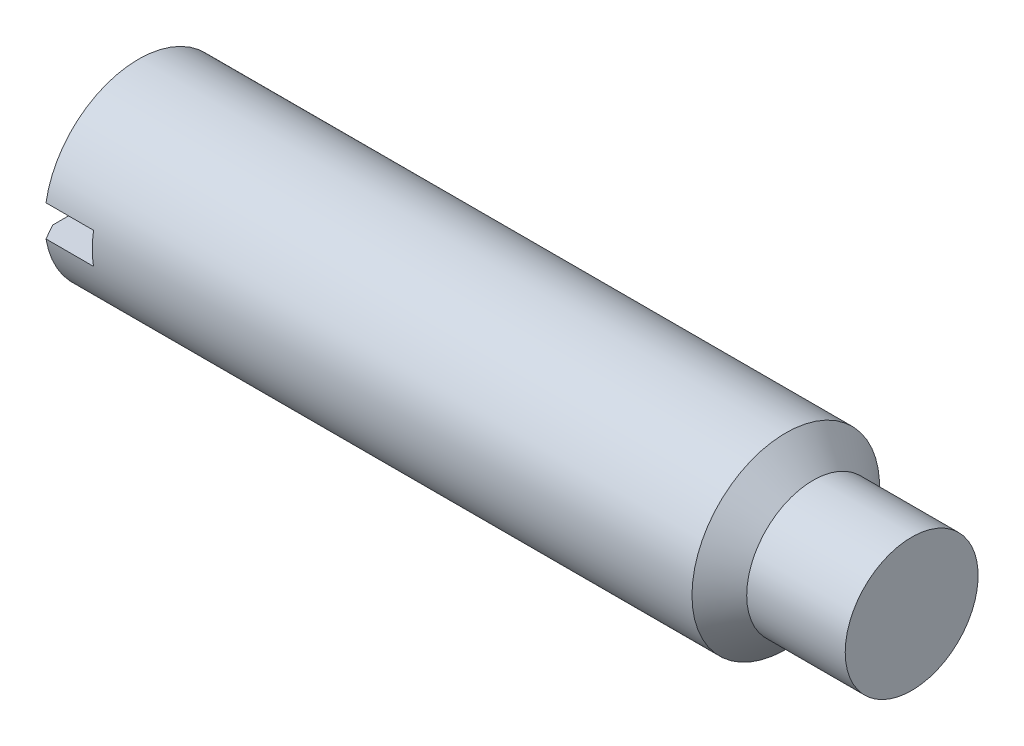
ISO-10303-21;
HEADER;
FILE_DESCRIPTION(('STEP AP214'),'2;1');
FILE_NAME('part.step','',(''),(''),'','','');
FILE_SCHEMA(('AUTOMOTIVE_DESIGN { 1 0 10303 214 1 1 1 1 }'));
ENDSEC;
DATA;
#1=APPLICATION_CONTEXT('core data for automotive mechanical design processes');
#2=APPLICATION_PROTOCOL_DEFINITION('international standard','automotive_design',2000,#1);
#3=PRODUCT_CONTEXT('',#1,'mechanical');
#4=PRODUCT('Part','Part','',(#3));
#5=PRODUCT_RELATED_PRODUCT_CATEGORY('part','',(#4));
#6=PRODUCT_DEFINITION_FORMATION('','',#4);
#7=PRODUCT_DEFINITION_CONTEXT('part definition',#1,'design');
#8=PRODUCT_DEFINITION('design','',#6,#7);
#9=PRODUCT_DEFINITION_SHAPE('','',#8);
#10=(LENGTH_UNIT() NAMED_UNIT(*) SI_UNIT(.MILLI.,.METRE.));
#11=(NAMED_UNIT(*) PLANE_ANGLE_UNIT() SI_UNIT($,.RADIAN.));
#12=(NAMED_UNIT(*) SI_UNIT($,.STERADIAN.) SOLID_ANGLE_UNIT());
#13=UNCERTAINTY_MEASURE_WITH_UNIT(LENGTH_MEASURE(1.E-05),#10,'distance_accuracy_value','');
#14=(GEOMETRIC_REPRESENTATION_CONTEXT(3) GLOBAL_UNCERTAINTY_ASSIGNED_CONTEXT((#13)) GLOBAL_UNIT_ASSIGNED_CONTEXT((#10,
#11,#12)) REPRESENTATION_CONTEXT('',''));
#15=CARTESIAN_POINT('',(0.,0.,0.));
#16=DIRECTION('',(0.,0.,1.));
#17=DIRECTION('',(1.,0.,0.));
#18=AXIS2_PLACEMENT_3D('',#15,#16,#17);
#19=CARTESIAN_POINT('',(0.,0.,0.));
#20=DIRECTION('',(-1.,0.,0.));
#21=DIRECTION('',(0.,0.,1.));
#22=AXIS2_PLACEMENT_3D('',#19,#20,#21);
#23=PLANE('',#22);
#24=CARTESIAN_POINT('',(0.,0.,0.));
#25=DIRECTION('',(-1.,0.,0.));
#26=DIRECTION('',(0.,0.,1.));
#27=AXIS2_PLACEMENT_3D('',#24,#25,#26);
#28=CIRCLE('',#27,5.036);
#29=CARTESIAN_POINT('',(0.,1.,4.93571636138058));
#30=VERTEX_POINT('',#29);
#31=CARTESIAN_POINT('',(0.,1.,-4.93571636138058));
#32=VERTEX_POINT('',#31);
#33=EDGE_CURVE('E107',#30,#32,#28,.T.);
#34=ORIENTED_EDGE('',*,*,#33,.T.);
#35=DIRECTION('',(0.,0.,1.));
#36=VECTOR('',#35,1.);
#37=CARTESIAN_POINT('',(0.,1.,-6.));
#38=LINE('',#37,#36);
#39=EDGE_CURVE('E179',#32,#30,#38,.T.);
#40=ORIENTED_EDGE('',*,*,#39,.T.);
#41=EDGE_LOOP('',(#34,#40));
#42=FACE_BOUND('',#41,.T.);
#43=ADVANCED_FACE('F34',(#42),#23,.T.);
#44=CARTESIAN_POINT('',(0.,-0.999999999999999,-4.93571636138058));
#45=VERTEX_POINT('',#44);
#46=CARTESIAN_POINT('',(0.,-1.,4.93571636138058));
#47=VERTEX_POINT('',#46);
#48=EDGE_CURVE('E103',#45,#47,#28,.T.);
#49=ORIENTED_EDGE('',*,*,#48,.T.);
#50=DIRECTION('',(0.,0.,-1.));
#51=VECTOR('',#50,1.);
#52=CARTESIAN_POINT('',(0.,-0.999999999999999,-6.));
#53=LINE('',#52,#51);
#54=EDGE_CURVE('E95',#47,#45,#53,.T.);
#55=ORIENTED_EDGE('',*,*,#54,.T.);
#56=EDGE_LOOP('',(#49,#55));
#57=FACE_BOUND('',#56,.T.);
#58=ADVANCED_FACE('F171',(#57),#23,.T.);
#59=CARTESIAN_POINT('',(0.,0.,0.));
#60=DIRECTION('',(1.,0.,0.));
#61=DIRECTION('',(0.,0.,-1.));
#62=AXIS2_PLACEMENT_3D('',#59,#60,#61);
#63=CONICAL_SURFACE('',#62,5.036,1.0471975511966);
#64=CARTESIAN_POINT('',(0.556565659498798,0.,0.));
#65=DIRECTION('',(-1.,0.,0.));
#66=DIRECTION('',(0.,0.,1.));
#67=AXIS2_PLACEMENT_3D('',#64,#65,#66);
#68=CIRCLE('',#67,6.);
#69=CARTESIAN_POINT('',(0.556565659498798,0.999999999999999,5.91607978309962));
#70=VERTEX_POINT('',#69);
#71=CARTESIAN_POINT('',(0.556565659498798,1.,-5.91607978309962));
#72=VERTEX_POINT('',#71);
#73=EDGE_CURVE('E100',#70,#72,#68,.T.);
#74=ORIENTED_EDGE('',*,*,#73,.T.);
#75=CARTESIAN_POINT('',(4.73989669271512,1.,-13.2079399731122));
#76=CARTESIAN_POINT('',(4.41853771720273,1.,-12.649708210717));
#77=CARTESIAN_POINT('',(4.09724308620736,1.,-12.0914392943508));
#78=CARTESIAN_POINT('',(3.45491866839179,1.,-10.9747439104666));
#79=CARTESIAN_POINT('',(3.13388888345054,1.,-10.416317441868));
#80=CARTESIAN_POINT('',(2.49197762047873,1.,-9.29878375972766));
#81=CARTESIAN_POINT('',(2.17109646770064,1.,-8.73967635935324));
#82=CARTESIAN_POINT('',(1.53002759234122,1.,-7.62106803973479));
#83=CARTESIAN_POINT('',(1.20983986573038,1.,-7.06156712280267));
#84=CARTESIAN_POINT('',(0.731752999683961,1.,-6.22374471344356));
#85=CARTESIAN_POINT('',(0.573331144759794,1.,-5.94572157695952));
#86=CARTESIAN_POINT('',(0.257006805730728,1.,-5.38937510078002));
#87=CARTESIAN_POINT('',(0.0991043281520769,1.,-5.11105175737021));
#88=CARTESIAN_POINT('',(-0.215803871687137,1.,-4.55405780901757));
#89=CARTESIAN_POINT('',(-0.37280995400945,1.,-4.27538740768459));
#90=CARTESIAN_POINT('',(-0.685421411461765,1.,-3.71727146951218));
#91=CARTESIAN_POINT('',(-0.841026834596479,1.,-3.4378259596707));
#92=CARTESIAN_POINT('',(-1.07280047051838,1.,-3.01670739395977));
#93=CARTESIAN_POINT('',(-1.15000341162097,1.,-2.87560489491714));
#94=CARTESIAN_POINT('',(-1.30334590311703,1.,-2.59280771309059));
#95=CARTESIAN_POINT('',(-1.37948536629279,1.,-2.45111298296054));
#96=CARTESIAN_POINT('',(-1.53019389021674,1.,-2.16666998976017));
#97=CARTESIAN_POINT('',(-1.60476099220106,1.,-2.02392068095135));
#98=CARTESIAN_POINT('',(-1.71445658720675,1.,-1.80870871103252));
#99=CARTESIAN_POINT('',(-1.75066016319053,1.,-1.73679509885044));
#100=CARTESIAN_POINT('',(-1.82208482318107,1.,-1.5924826177324));
#101=CARTESIAN_POINT('',(-1.85730593731408,1.,-1.52008376376053));
#102=CARTESIAN_POINT('',(-1.92735529771603,1.,-1.37261463948875));
#103=CARTESIAN_POINT('',(-1.96214530553779,1.,-1.2975261121665));
#104=CARTESIAN_POINT('',(-2.02965956084305,1.,-1.14642727351878));
#105=CARTESIAN_POINT('',(-2.06238404828153,1.,-1.07041707049348));
#106=CARTESIAN_POINT('',(-2.12476431844618,1.,-0.917145557122539));
#107=CARTESIAN_POINT('',(-2.15442052211012,1.,-0.839884420078907));
#108=CARTESIAN_POINT('',(-2.2090625580553,1.,-0.683706866904181));
#109=CARTESIAN_POINT('',(-2.23405029456057,1.,-0.604791140337811));
#110=CARTESIAN_POINT('',(-2.27018581045359,1.,-0.470093422562119));
#111=CARTESIAN_POINT('',(-2.28321589301003,1.,-0.414824677608287));
#112=CARTESIAN_POINT('',(-2.30494623034629,1.,-0.303453047162495));
#113=CARTESIAN_POINT('',(-2.31364920633177,1.,-0.24735070881893));
#114=CARTESIAN_POINT('',(-2.32581520982498,1.,-0.134957059900361));
#115=CARTESIAN_POINT('',(-2.3293144088948,1.,-0.0786698056189405));
#116=CARTESIAN_POINT('',(-2.33076867881178,1.,0.0339758725517423));
#117=CARTESIAN_POINT('',(-2.32872385654262,1.,0.0903342950480082));
#118=CARTESIAN_POINT('',(-2.31805799120998,1.,0.217768647722681));
#119=CARTESIAN_POINT('',(-2.30780921847849,1.,0.288706275864214));
#120=CARTESIAN_POINT('',(-2.28041448951623,1.,0.429255862703559));
#121=CARTESIAN_POINT('',(-2.26326048587775,1.,0.498866175055746));
#122=CARTESIAN_POINT('',(-2.23367324230808,1.,0.602653040472923));
#123=CARTESIAN_POINT('',(-2.22308279162356,1.,0.6373773718197));
#124=CARTESIAN_POINT('',(-2.20083833270274,1.,0.706460987269513));
#125=CARTESIAN_POINT('',(-2.18918499575353,1.,0.740820486687558));
#126=CARTESIAN_POINT('',(-2.16499431488937,1.,0.809218732225267));
#127=CARTESIAN_POINT('',(-2.15245710212601,1.,0.843257525085967));
#128=CARTESIAN_POINT('',(-2.12664333011366,1.,0.911058624630632));
#129=CARTESIAN_POINT('',(-2.11336665637932,1.,0.944820887568145));
#130=CARTESIAN_POINT('',(-2.06998388355714,1.,1.05227293315327));
#131=CARTESIAN_POINT('',(-2.03871498859554,1.,1.12549298780845));
#132=CARTESIAN_POINT('',(-1.97418773021607,1.,1.27105481935645));
#133=CARTESIAN_POINT('',(-1.94092900538461,1.,1.34339643380989));
#134=CARTESIAN_POINT('',(-1.87300145739183,1.,1.48745172367314));
#135=CARTESIAN_POINT('',(-1.83833201130296,1.,1.55916510431147));
#136=CARTESIAN_POINT('',(-1.76798292469947,1.,1.70209571429579));
#137=CARTESIAN_POINT('',(-1.73230324722233,1.,1.77331292536874));
#138=CARTESIAN_POINT('',(-1.62404833166118,1.,1.98662313536882));
#139=CARTESIAN_POINT('',(-1.55036430564694,1.,2.1281523722822));
#140=CARTESIAN_POINT('',(-1.40130813476187,1.,2.41025810099279));
#141=CARTESIAN_POINT('',(-1.32593649694026,1.,2.55083486285897));
#142=CARTESIAN_POINT('',(-1.17450983157169,1.,2.83063597104617));
#143=CARTESIAN_POINT('',(-1.09846071331581,1.,2.96986351882444));
#144=CARTESIAN_POINT('',(-0.945628453571451,1.,3.24792809661572));
#145=CARTESIAN_POINT('',(-0.868845256727794,1.,3.38676509614028));
#146=CARTESIAN_POINT('',(-0.637891315016442,1.,3.80258527592098));
#147=CARTESIAN_POINT('',(-0.482967580838984,1.,4.07914988720849));
#148=CARTESIAN_POINT('',(-0.119566497032843,1.,4.72494312842674));
#149=CARTESIAN_POINT('',(0.0893330443968288,0.999999999999999,5.09393352805971));
#150=CARTESIAN_POINT('',(0.508131169895009,0.999999999999999,5.83135176267467));
#151=CARTESIAN_POINT('',(0.718029765114886,0.999999999999999,6.19977959131637));
#152=CARTESIAN_POINT('',(1.13850339248251,0.999999999999999,6.93645171703373));
#153=CARTESIAN_POINT('',(1.34907866934783,0.999999999999999,7.30469587434899));
#154=CARTESIAN_POINT('',(1.77060223251522,0.999999999999999,8.0409687738802));
#155=CARTESIAN_POINT('',(1.98155051744525,0.999999999999999,8.40899751688193));
#156=CARTESIAN_POINT('',(2.40459995529733,0.999999999999999,9.14648067015084));
#157=CARTESIAN_POINT('',(2.61670218630737,0.999999999999999,9.51593446186605));
#158=CARTESIAN_POINT('',(3.04108596616415,0.999999999999999,10.2547396320318));
#159=CARTESIAN_POINT('',(3.25336751523056,0.999999999999999,10.6240910103561));
#160=CARTESIAN_POINT('',(3.67796813526824,0.999999999999999,11.3625576054528));
#161=CARTESIAN_POINT('',(3.8902871493782,0.999999999999999,11.7316728549223));
#162=CARTESIAN_POINT('',(4.3150247446798,0.999999999999999,12.4698454062708));
#163=CARTESIAN_POINT('',(4.52744332573741,0.999999999999999,12.8389027082268));
#164=CARTESIAN_POINT('',(4.73989669271511,0.999999999999999,13.2079399731122));
#165=B_SPLINE_CURVE_WITH_KNOTS('',3,(#75,#76,#77,#78,#79,#80,#81,#82,#83,#84,#85,#86,#87,#88,
#89,#90,#91,#92,#93,#94,#95,#96,#97,#98,#99,#100,#101,#102,#103,#104,#105,#106,#107,#108,#109,
#110,#111,#112,#113,#114,#115,#116,#117,#118,#119,#120,#121,#122,#123,#124,#125,#126,#127,#128,
#129,#130,#131,#132,#133,#134,#135,#136,#137,#138,#139,#140,#141,#142,#143,#144,#145,#146,#147,
#148,#149,#150,#151,#152,#153,#154,#155,#156,#157,#158,#159,#160,#161,#162,#163,#164),
.UNSPECIFIED.,.F.,.F.,(4,2,2,2,2,2,2,2,2,2,2,2,2,2,2,2,2,2,2,2,2,2,2,2,2,2,2,2,2,2,2,2,2,2,2,2,
2,2,2,2,2,2,2,2,4),(0.,1.93236881448578,3.86475122216993,5.79868288382605,7.73260327702253,
8.69257649447076,9.6525617287506,10.612129556186,11.5716643702223,12.054187654427,
12.5367502815658,13.0198822422751,13.2614145867642,13.5029395167374,13.7511887400155,
13.9994090704805,14.2475953023238,14.4956800792535,14.6658994442621,14.8360116268791,
15.0049357373549,15.1738565911513,15.3884236657494,15.6032415257328,15.7121389898233,
15.8209681475884,15.9297811908741,16.0386111279729,16.2774120534183,16.5162564848264,
16.7552075514776,16.9941673722394,17.4728272005408,17.9513450939744,18.4272722369027,
18.9032355559971,19.854231673644,21.1262890781154,22.3983607146554,23.6709606308451,
24.9435558756861,26.2215820771641,27.4996098466158,28.7770795475622,30.0545475337869),.UNSPECIFIED.);
#166=EDGE_CURVE('E128',#72,#32,#165,.T.);
#167=ORIENTED_EDGE('',*,*,#166,.T.);
#168=ORIENTED_EDGE('',*,*,#33,.F.);
#169=EDGE_CURVE('E130',#30,#70,#165,.T.);
#170=ORIENTED_EDGE('',*,*,#169,.T.);
#171=EDGE_LOOP('',(#74,#167,#168,#170));
#172=FACE_BOUND('',#171,.T.);
#173=ADVANCED_FACE('F143',(#172),#63,.T.);
#174=CARTESIAN_POINT('',(0.556565659498798,-0.999999999999999,-5.91607978309962));
#175=VERTEX_POINT('',#174);
#176=CARTESIAN_POINT('',(0.556565659498798,-1.,5.91607978309962));
#177=VERTEX_POINT('',#176);
#178=EDGE_CURVE('E104',#175,#177,#68,.T.);
#179=ORIENTED_EDGE('',*,*,#178,.T.);
#180=CARTESIAN_POINT('',(4.73989669271512,-1.,13.2079399731122));
#181=CARTESIAN_POINT('',(4.41853771720273,-1.,12.649708210717));
#182=CARTESIAN_POINT('',(4.09724308620736,-1.,12.0914392943508));
#183=CARTESIAN_POINT('',(3.45491866839179,-1.,10.9747439104666));
#184=CARTESIAN_POINT('',(3.13388888345054,-1.,10.416317441868));
#185=CARTESIAN_POINT('',(2.49197762047873,-1.,9.29878375972766));
#186=CARTESIAN_POINT('',(2.17109646770064,-1.,8.73967635935324));
#187=CARTESIAN_POINT('',(1.53002759234122,-1.,7.62106803973479));
#188=CARTESIAN_POINT('',(1.20983986573038,-1.,7.06156712280267));
#189=CARTESIAN_POINT('',(0.731752999683961,-1.,6.22374471344356));
#190=CARTESIAN_POINT('',(0.573331144759794,-1.,5.94572157695952));
#191=CARTESIAN_POINT('',(0.257006805730728,-1.,5.38937510078002));
#192=CARTESIAN_POINT('',(0.0991043281520769,-1.,5.11105175737021));
#193=CARTESIAN_POINT('',(-0.215803871687137,-1.,4.55405780901757));
#194=CARTESIAN_POINT('',(-0.37280995400945,-1.,4.27538740768459));
#195=CARTESIAN_POINT('',(-0.685421411461765,-1.,3.71727146951218));
#196=CARTESIAN_POINT('',(-0.841026834596479,-1.,3.4378259596707));
#197=CARTESIAN_POINT('',(-1.07280047051838,-1.,3.01670739395977));
#198=CARTESIAN_POINT('',(-1.15000341162097,-1.,2.87560489491714));
#199=CARTESIAN_POINT('',(-1.30334590311703,-1.,2.59280771309059));
#200=CARTESIAN_POINT('',(-1.37948536629279,-1.,2.45111298296054));
#201=CARTESIAN_POINT('',(-1.53019389021674,-1.,2.16666998976017));
#202=CARTESIAN_POINT('',(-1.60476099220106,-1.,2.02392068095135));
#203=CARTESIAN_POINT('',(-1.71445658720675,-1.,1.80870871103252));
#204=CARTESIAN_POINT('',(-1.75066016319053,-1.,1.73679509885045));
#205=CARTESIAN_POINT('',(-1.82208482318107,-1.,1.5924826177324));
#206=CARTESIAN_POINT('',(-1.85730593731408,-1.,1.52008376376053));
#207=CARTESIAN_POINT('',(-1.92735529771603,-1.,1.37261463948875));
#208=CARTESIAN_POINT('',(-1.96214530553779,-1.,1.2975261121665));
#209=CARTESIAN_POINT('',(-2.02965956084305,-1.,1.14642727351878));
#210=CARTESIAN_POINT('',(-2.06238404828153,-1.,1.07041707049348));
#211=CARTESIAN_POINT('',(-2.12476431844618,-1.,0.917145557122538));
#212=CARTESIAN_POINT('',(-2.15442052211012,-1.,0.839884420078906));
#213=CARTESIAN_POINT('',(-2.2090625580553,-1.,0.68370686690418));
#214=CARTESIAN_POINT('',(-2.23405029456057,-1.,0.604791140337811));
#215=CARTESIAN_POINT('',(-2.27018581045359,-1.,0.470093422562118));
#216=CARTESIAN_POINT('',(-2.28321589301003,-1.,0.414824677608285));
#217=CARTESIAN_POINT('',(-2.30494623034629,-1.,0.303453047162493));
#218=CARTESIAN_POINT('',(-2.31364920633177,-1.,0.247350708818928));
#219=CARTESIAN_POINT('',(-2.32581520982498,-1.,0.13495705990036));
#220=CARTESIAN_POINT('',(-2.3293144088948,-1.,0.0786698056189395));
#221=CARTESIAN_POINT('',(-2.33076867881178,-1.,-0.0339758725517433));
#222=CARTESIAN_POINT('',(-2.32872385654262,-1.,-0.0903342950480093));
#223=CARTESIAN_POINT('',(-2.31805799120998,-1.,-0.217768647722682));
#224=CARTESIAN_POINT('',(-2.30780921847849,-1.,-0.288706275864215));
#225=CARTESIAN_POINT('',(-2.28041448951623,-1.,-0.42925586270356));
#226=CARTESIAN_POINT('',(-2.26326048587775,-1.,-0.498866175055748));
#227=CARTESIAN_POINT('',(-2.23367324230808,-1.,-0.602653040472925));
#228=CARTESIAN_POINT('',(-2.22308279162355,-1.,-0.637377371819703));
#229=CARTESIAN_POINT('',(-2.20083833270274,-1.,-0.706460987269517));
#230=CARTESIAN_POINT('',(-2.18918499575353,-1.,-0.740820486687562));
#231=CARTESIAN_POINT('',(-2.16499431488936,-1.,-0.809218732225272));
#232=CARTESIAN_POINT('',(-2.15245710212601,-1.,-0.843257525085971));
#233=CARTESIAN_POINT('',(-2.12664333011366,-1.,-0.911058624630635));
#234=CARTESIAN_POINT('',(-2.11336665637932,-1.,-0.944820887568148));
#235=CARTESIAN_POINT('',(-2.06998388355714,-1.,-1.05227293315327));
#236=CARTESIAN_POINT('',(-2.03871498859553,-1.,-1.12549298780845));
#237=CARTESIAN_POINT('',(-1.97418773021607,-1.,-1.27105481935645));
#238=CARTESIAN_POINT('',(-1.94092900538461,-1.,-1.34339643380989));
#239=CARTESIAN_POINT('',(-1.87300145739183,-1.,-1.48745172367313));
#240=CARTESIAN_POINT('',(-1.83833201130296,-1.,-1.55916510431147));
#241=CARTESIAN_POINT('',(-1.76798292469947,-1.,-1.70209571429579));
#242=CARTESIAN_POINT('',(-1.73230324722233,-1.,-1.77331292536874));
#243=CARTESIAN_POINT('',(-1.62404833166118,-1.,-1.98662313536882));
#244=CARTESIAN_POINT('',(-1.55036430564694,-1.,-2.1281523722822));
#245=CARTESIAN_POINT('',(-1.40130813476187,-1.,-2.41025810099279));
#246=CARTESIAN_POINT('',(-1.32593649694026,-1.,-2.55083486285897));
#247=CARTESIAN_POINT('',(-1.17450983157168,-1.,-2.83063597104617));
#248=CARTESIAN_POINT('',(-1.09846071331581,-1.,-2.96986351882444));
#249=CARTESIAN_POINT('',(-0.945628453571448,-1.,-3.24792809661573));
#250=CARTESIAN_POINT('',(-0.868845256727791,-1.,-3.38676509614028));
#251=CARTESIAN_POINT('',(-0.637891315016438,-0.999999999999999,-3.80258527592098));
#252=CARTESIAN_POINT('',(-0.48296758083898,-1.,-4.0791498872085));
#253=CARTESIAN_POINT('',(-0.119566497032838,-1.,-4.72494312842675));
#254=CARTESIAN_POINT('',(0.0893330443968341,-0.999999999999999,-5.09393352805972));
#255=CARTESIAN_POINT('',(0.508131169895014,-0.999999999999999,-5.83135176267468));
#256=CARTESIAN_POINT('',(0.718029765114891,-0.999999999999999,-6.19977959131638));
#257=CARTESIAN_POINT('',(1.13850339248252,-0.999999999999999,-6.93645171703374));
#258=CARTESIAN_POINT('',(1.34907866934783,-0.999999999999999,-7.30469587434899));
#259=CARTESIAN_POINT('',(1.77060223251522,-0.999999999999999,-8.04096877388021));
#260=CARTESIAN_POINT('',(1.98155051744525,-0.999999999999999,-8.40899751688194));
#261=CARTESIAN_POINT('',(2.40459995529733,-0.999999999999999,-9.14648067015085));
#262=CARTESIAN_POINT('',(2.61670218630738,-0.999999999999999,-9.51593446186606));
#263=CARTESIAN_POINT('',(3.04108596616415,-0.999999999999999,-10.2547396320318));
#264=CARTESIAN_POINT('',(3.25336751523057,-0.999999999999999,-10.6240910103561));
#265=CARTESIAN_POINT('',(3.67796813526824,-0.999999999999999,-11.3625576054528));
#266=CARTESIAN_POINT('',(3.8902871493782,-0.999999999999999,-11.7316728549223));
#267=CARTESIAN_POINT('',(4.31502474467981,-0.999999999999999,-12.4698454062708));
#268=CARTESIAN_POINT('',(4.52744332573742,-0.999999999999999,-12.8389027082268));
#269=CARTESIAN_POINT('',(4.73989669271512,-0.999999999999999,-13.2079399731122));
#270=B_SPLINE_CURVE_WITH_KNOTS('',3,(#180,#181,#182,#183,#184,#185,#186,#187,#188,#189,#190,
#191,#192,#193,#194,#195,#196,#197,#198,#199,#200,#201,#202,#203,#204,#205,#206,#207,#208,#209,
#210,#211,#212,#213,#214,#215,#216,#217,#218,#219,#220,#221,#222,#223,#224,#225,#226,#227,#228,
#229,#230,#231,#232,#233,#234,#235,#236,#237,#238,#239,#240,#241,#242,#243,#244,#245,#246,#247,
#248,#249,#250,#251,#252,#253,#254,#255,#256,#257,#258,#259,#260,#261,#262,#263,#264,#265,#266,
#267,#268,#269),.UNSPECIFIED.,.F.,.F.,(4,2,2,2,2,2,2,2,2,2,2,2,2,2,2,2,2,2,2,2,2,2,2,2,2,2,2,2,
2,2,2,2,2,2,2,2,2,2,2,2,2,2,2,2,4),(0.,1.93236881448578,3.86475122216993,5.79868288382605,
7.73260327702253,8.69257649447076,9.6525617287506,10.612129556186,11.5716643702223,
12.054187654427,12.5367502815658,13.0198822422751,13.2614145867642,13.5029395167374,
13.7511887400155,13.9994090704805,14.2475953023238,14.4956800792535,14.6658994442621,
14.8360116268791,15.0049357373549,15.1738565911513,15.3884236657494,15.6032415257328,
15.7121389898233,15.8209681475884,15.9297811908742,16.0386111279729,16.2774120534183,
16.5162564848264,16.7552075514776,16.9941673722394,17.4728272005409,17.9513450939744,
18.4272722369027,18.9032355559972,19.8542316736441,21.1262890781154,22.3983607146554,
23.6709606308451,24.9435558756861,26.2215820771642,27.4996098466158,28.7770795475622,
30.0545475337869),.UNSPECIFIED.);
#271=EDGE_CURVE('E125',#177,#47,#270,.T.);
#272=ORIENTED_EDGE('',*,*,#271,.T.);
#273=ORIENTED_EDGE('',*,*,#48,.F.);
#274=EDGE_CURVE('E126',#45,#175,#270,.T.);
#275=ORIENTED_EDGE('',*,*,#274,.T.);
#276=EDGE_LOOP('',(#179,#272,#273,#275));
#277=FACE_BOUND('',#276,.T.);
#278=ADVANCED_FACE('F123',(#277),#63,.T.);
#279=CARTESIAN_POINT('',(-12.7,0.,0.));
#280=DIRECTION('',(-1.,0.,0.));
#281=DIRECTION('',(0.,0.,1.));
#282=AXIS2_PLACEMENT_3D('',#279,#280,#281);
#283=CYLINDRICAL_SURFACE('',#282,6.);
#284=CARTESIAN_POINT('',(41.95,0.,0.));
#285=DIRECTION('',(-1.,0.,0.));
#286=DIRECTION('',(0.,0.,1.));
#287=AXIS2_PLACEMENT_3D('',#284,#285,#286);
#288=CIRCLE('',#287,6.);
#289=CARTESIAN_POINT('',(41.95,0.,6.));
#290=VERTEX_POINT('',#289);
#291=EDGE_CURVE('E110',#290,#290,#288,.T.);
#292=ORIENTED_EDGE('',*,*,#291,.T.);
#293=EDGE_LOOP('',(#292));
#294=FACE_BOUND('',#293,.T.);
#295=ORIENTED_EDGE('',*,*,#73,.F.);
#296=DIRECTION('',(-1.,0.,0.));
#297=VECTOR('',#296,1.);
#298=CARTESIAN_POINT('',(-12.7,0.999999999999999,5.91607978309962));
#299=LINE('',#298,#297);
#300=CARTESIAN_POINT('',(3.6,0.999999999999999,5.91607978309962));
#301=VERTEX_POINT('',#300);
#302=EDGE_CURVE('E11',#70,#301,#299,.F.);
#303=ORIENTED_EDGE('',*,*,#302,.T.);
#304=CARTESIAN_POINT('',(3.6,0.,0.));
#305=DIRECTION('',(1.,0.,0.));
#306=DIRECTION('',(0.,0.,-1.));
#307=AXIS2_PLACEMENT_3D('',#304,#305,#306);
#308=CIRCLE('',#307,6.);
#309=CARTESIAN_POINT('',(3.6,-1.,5.91607978309962));
#310=VERTEX_POINT('',#309);
#311=EDGE_CURVE('E82',#310,#301,#308,.F.);
#312=ORIENTED_EDGE('',*,*,#311,.F.);
#313=DIRECTION('',(-1.,0.,0.));
#314=VECTOR('',#313,1.);
#315=CARTESIAN_POINT('',(-12.7,-1.,5.91607978309962));
#316=LINE('',#315,#314);
#317=EDGE_CURVE('E41',#310,#177,#316,.T.);
#318=ORIENTED_EDGE('',*,*,#317,.T.);
#319=ORIENTED_EDGE('',*,*,#178,.F.);
#320=DIRECTION('',(-1.,0.,0.));
#321=VECTOR('',#320,1.);
#322=CARTESIAN_POINT('',(-12.7,-0.999999999999999,-5.91607978309962));
#323=LINE('',#322,#321);
#324=CARTESIAN_POINT('',(3.6,-0.999999999999999,-5.91607978309962));
#325=VERTEX_POINT('',#324);
#326=EDGE_CURVE('E115',#175,#325,#323,.F.);
#327=ORIENTED_EDGE('',*,*,#326,.T.);
#328=CARTESIAN_POINT('',(3.6,1.,-5.91607978309962));
#329=VERTEX_POINT('',#328);
#330=EDGE_CURVE('E91',#329,#325,#308,.F.);
#331=ORIENTED_EDGE('',*,*,#330,.F.);
#332=DIRECTION('',(-1.,0.,0.));
#333=VECTOR('',#332,1.);
#334=CARTESIAN_POINT('',(-12.7,1.,-5.91607978309962));
#335=LINE('',#334,#333);
#336=EDGE_CURVE('E89',#329,#72,#335,.T.);
#337=ORIENTED_EDGE('',*,*,#336,.T.);
#338=EDGE_LOOP('',(#295,#303,#312,#318,#319,#327,#331,#337));
#339=FACE_BOUND('',#338,.T.);
#340=ADVANCED_FACE('F98',(#294,#339),#283,.T.);
#341=CARTESIAN_POINT('',(43.7,0.,0.));
#342=DIRECTION('',(-1.,0.,0.));
#343=DIRECTION('',(0.,0.,1.));
#344=AXIS2_PLACEMENT_3D('',#341,#342,#343);
#345=CONICAL_SURFACE('',#344,4.25,0.785398163397446);
#346=ORIENTED_EDGE('',*,*,#291,.F.);
#347=EDGE_LOOP('',(#346));
#348=FACE_BOUND('',#347,.T.);
#349=CARTESIAN_POINT('',(43.7,0.,0.));
#350=DIRECTION('',(-1.,0.,0.));
#351=DIRECTION('',(0.,0.,1.));
#352=AXIS2_PLACEMENT_3D('',#349,#350,#351);
#353=CIRCLE('',#352,4.25);
#354=CARTESIAN_POINT('',(43.7,0.,4.25));
#355=VERTEX_POINT('',#354);
#356=EDGE_CURVE('E183',#355,#355,#353,.T.);
#357=ORIENTED_EDGE('',*,*,#356,.T.);
#358=EDGE_LOOP('',(#357));
#359=FACE_BOUND('',#358,.T.);
#360=ADVANCED_FACE('F160',(#348,#359),#345,.T.);
#361=CARTESIAN_POINT('',(-12.7,0.,0.));
#362=DIRECTION('',(-1.,0.,0.));
#363=DIRECTION('',(0.,0.,1.));
#364=AXIS2_PLACEMENT_3D('',#361,#362,#363);
#365=CYLINDRICAL_SURFACE('',#364,4.25);
#366=CARTESIAN_POINT('',(50.,0.,0.));
#367=DIRECTION('',(-1.,0.,0.));
#368=DIRECTION('',(0.,0.,1.));
#369=AXIS2_PLACEMENT_3D('',#366,#367,#368);
#370=CIRCLE('',#369,4.25);
#371=CARTESIAN_POINT('',(50.,0.,4.25));
#372=VERTEX_POINT('',#371);
#373=EDGE_CURVE('E181',#372,#372,#370,.T.);
#374=ORIENTED_EDGE('',*,*,#373,.T.);
#375=EDGE_LOOP('',(#374));
#376=FACE_BOUND('',#375,.T.);
#377=ORIENTED_EDGE('',*,*,#356,.F.);
#378=EDGE_LOOP('',(#377));
#379=FACE_BOUND('',#378,.T.);
#380=ADVANCED_FACE('F156',(#376,#379),#365,.T.);
#381=CARTESIAN_POINT('',(50.,4.25,0.));
#382=DIRECTION('',(1.,0.,0.));
#383=DIRECTION('',(0.,0.,-1.));
#384=AXIS2_PLACEMENT_3D('',#381,#382,#383);
#385=PLANE('',#384);
#386=ORIENTED_EDGE('',*,*,#373,.F.);
#387=EDGE_LOOP('',(#386));
#388=FACE_BOUND('',#387,.T.);
#389=ADVANCED_FACE('F153',(#388),#385,.T.);
#390=CARTESIAN_POINT('',(3.6,1.,-6.));
#391=DIRECTION('',(0.,-1.,0.));
#392=DIRECTION('',(0.,0.,-1.));
#393=AXIS2_PLACEMENT_3D('',#390,#391,#392);
#394=PLANE('',#393);
#395=ORIENTED_EDGE('',*,*,#39,.F.);
#396=ORIENTED_EDGE('',*,*,#166,.F.);
#397=ORIENTED_EDGE('',*,*,#336,.F.);
#398=DIRECTION('',(0.,0.,1.));
#399=VECTOR('',#398,1.);
#400=CARTESIAN_POINT('',(3.6,1.,-6.));
#401=LINE('',#400,#399);
#402=EDGE_CURVE('E48',#329,#301,#401,.T.);
#403=ORIENTED_EDGE('',*,*,#402,.T.);
#404=ORIENTED_EDGE('',*,*,#302,.F.);
#405=ORIENTED_EDGE('',*,*,#169,.F.);
#406=EDGE_LOOP('',(#395,#396,#397,#403,#404,#405));
#407=FACE_BOUND('',#406,.T.);
#408=ADVANCED_FACE('F92',(#407),#394,.T.);
#409=CARTESIAN_POINT('',(3.6,-0.999999999999999,-6.));
#410=DIRECTION('',(0.,1.,0.));
#411=DIRECTION('',(0.,0.,1.));
#412=AXIS2_PLACEMENT_3D('',#409,#410,#411);
#413=PLANE('',#412);
#414=ORIENTED_EDGE('',*,*,#54,.F.);
#415=ORIENTED_EDGE('',*,*,#271,.F.);
#416=ORIENTED_EDGE('',*,*,#317,.F.);
#417=DIRECTION('',(0.,0.,-1.));
#418=VECTOR('',#417,1.);
#419=CARTESIAN_POINT('',(3.6,-0.999999999999999,-6.));
#420=LINE('',#419,#418);
#421=EDGE_CURVE('E85',#310,#325,#420,.T.);
#422=ORIENTED_EDGE('',*,*,#421,.T.);
#423=ORIENTED_EDGE('',*,*,#326,.F.);
#424=ORIENTED_EDGE('',*,*,#274,.F.);
#425=EDGE_LOOP('',(#414,#415,#416,#422,#423,#424));
#426=FACE_BOUND('',#425,.T.);
#427=ADVANCED_FACE('F146',(#426),#413,.T.);
#428=CARTESIAN_POINT('',(3.6,1.,-6.));
#429=DIRECTION('',(1.,0.,0.));
#430=DIRECTION('',(0.,0.,-1.));
#431=AXIS2_PLACEMENT_3D('',#428,#429,#430);
#432=PLANE('',#431);
#433=ORIENTED_EDGE('',*,*,#421,.F.);
#434=ORIENTED_EDGE('',*,*,#311,.T.);
#435=ORIENTED_EDGE('',*,*,#402,.F.);
#436=ORIENTED_EDGE('',*,*,#330,.T.);
#437=EDGE_LOOP('',(#433,#434,#435,#436));
#438=FACE_BOUND('',#437,.T.);
#439=ADVANCED_FACE('F83',(#438),#432,.F.);
#440=CLOSED_SHELL('',(#43,#58,#173,#278,#340,#360,#380,#389,#408,#427,#439));
#441=MANIFOLD_SOLID_BREP('B2',#440);
#442=ADVANCED_BREP_SHAPE_REPRESENTATION('',(#18,#441),#14);
#443=SHAPE_DEFINITION_REPRESENTATION(#9,#442);
ENDSEC;
END-ISO-10303-21;
